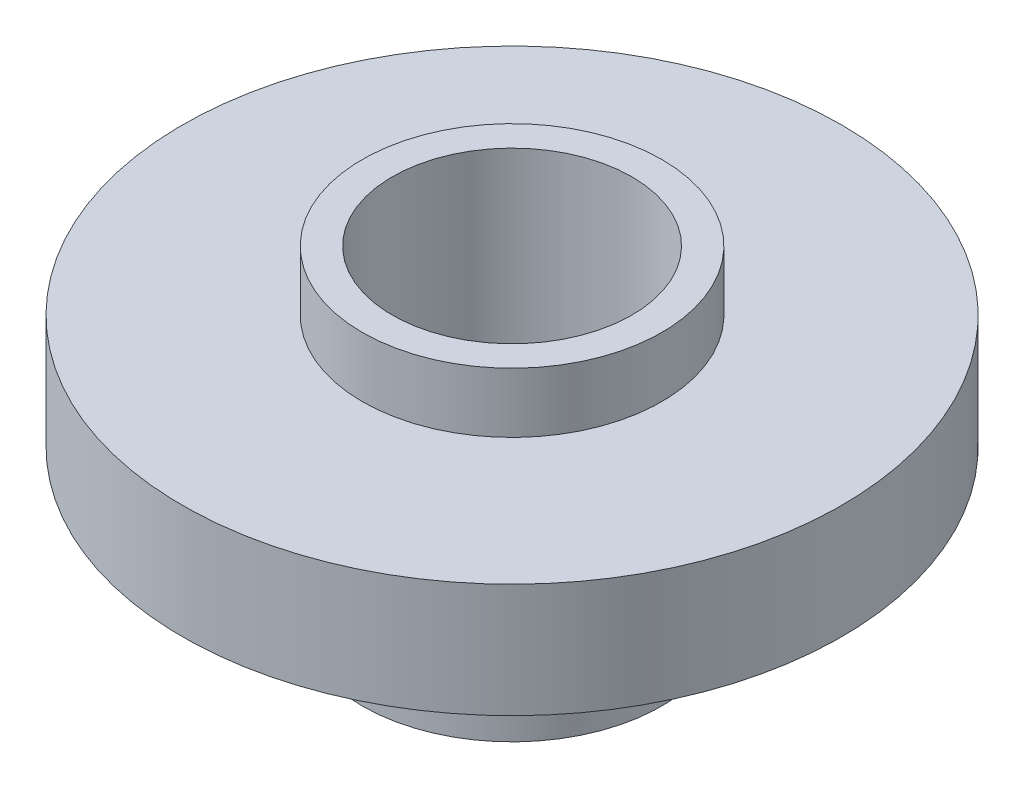
ISO-10303-21;
HEADER;
FILE_DESCRIPTION(('STEP AP214'),'2;1');
FILE_NAME('part.step','',(''),(''),'','','');
FILE_SCHEMA(('AUTOMOTIVE_DESIGN { 1 0 10303 214 1 1 1 1 }'));
ENDSEC;
DATA;
#1=APPLICATION_CONTEXT('core data for automotive mechanical design processes');
#2=APPLICATION_PROTOCOL_DEFINITION('international standard','automotive_design',2000,#1);
#3=PRODUCT_CONTEXT('',#1,'mechanical');
#4=PRODUCT('Part','Part','',(#3));
#5=PRODUCT_RELATED_PRODUCT_CATEGORY('part','',(#4));
#6=PRODUCT_DEFINITION_FORMATION('','',#4);
#7=PRODUCT_DEFINITION_CONTEXT('part definition',#1,'design');
#8=PRODUCT_DEFINITION('design','',#6,#7);
#9=PRODUCT_DEFINITION_SHAPE('','',#8);
#10=(LENGTH_UNIT() NAMED_UNIT(*) SI_UNIT(.MILLI.,.METRE.));
#11=(NAMED_UNIT(*) PLANE_ANGLE_UNIT() SI_UNIT($,.RADIAN.));
#12=(NAMED_UNIT(*) SI_UNIT($,.STERADIAN.) SOLID_ANGLE_UNIT());
#13=UNCERTAINTY_MEASURE_WITH_UNIT(LENGTH_MEASURE(1.E-05),#10,'distance_accuracy_value','');
#14=(GEOMETRIC_REPRESENTATION_CONTEXT(3) GLOBAL_UNCERTAINTY_ASSIGNED_CONTEXT((#13)) GLOBAL_UNIT_ASSIGNED_CONTEXT((#10,
#11,#12)) REPRESENTATION_CONTEXT('',''));
#15=CARTESIAN_POINT('',(0.,0.,0.));
#16=DIRECTION('',(0.,0.,1.));
#17=DIRECTION('',(1.,0.,0.));
#18=AXIS2_PLACEMENT_3D('',#15,#16,#17);
#19=CARTESIAN_POINT('',(-3.73244816247052,3.8,0.493369584694379));
#20=DIRECTION('',(0.,1.,0.));
#21=DIRECTION('',(0.,0.,1.));
#22=AXIS2_PLACEMENT_3D('',#19,#20,#21);
#23=PLANE('',#22);
#24=CARTESIAN_POINT('',(-3.73244816247052,3.8,0.493369584694379));
#25=DIRECTION('',(0.,1.,0.));
#26=DIRECTION('',(0.,0.,1.));
#27=AXIS2_PLACEMENT_3D('',#24,#25,#26);
#28=CIRCLE('',#27,5.);
#29=CARTESIAN_POINT('',(-3.73244816247052,3.8,-4.50663041530562));
#30=VERTEX_POINT('',#29);
#31=EDGE_CURVE('E10',#30,#30,#28,.T.);
#32=ORIENTED_EDGE('',*,*,#31,.F.);
#33=EDGE_LOOP('',(#32));
#34=FACE_BOUND('',#33,.T.);
#35=CARTESIAN_POINT('',(-3.73244816247052,3.8,0.493369584694379));
#36=DIRECTION('',(0.,1.,0.));
#37=DIRECTION('',(0.,0.,1.));
#38=AXIS2_PLACEMENT_3D('',#35,#36,#37);
#39=CIRCLE('',#38,11.);
#40=CARTESIAN_POINT('',(-3.73244816247052,3.8,-10.5066304153056));
#41=VERTEX_POINT('',#40);
#42=EDGE_CURVE('E40',#41,#41,#39,.T.);
#43=ORIENTED_EDGE('',*,*,#42,.T.);
#44=EDGE_LOOP('',(#43));
#45=FACE_BOUND('',#44,.T.);
#46=ADVANCED_FACE('F32',(#34,#45),#23,.T.);
#47=CARTESIAN_POINT('',(-3.73244816247052,0.,0.493369584694379));
#48=DIRECTION('',(0.,1.,0.));
#49=DIRECTION('',(0.,0.,1.));
#50=AXIS2_PLACEMENT_3D('',#47,#48,#49);
#51=PLANE('',#50);
#52=CARTESIAN_POINT('',(-3.73244816247052,0.,0.493369584694379));
#53=DIRECTION('',(0.,1.,0.));
#54=DIRECTION('',(0.,0.,1.));
#55=AXIS2_PLACEMENT_3D('',#52,#53,#54);
#56=CIRCLE('',#55,5.);
#57=CARTESIAN_POINT('',(-3.73244816247052,0.,-4.50663041530562));
#58=VERTEX_POINT('',#57);
#59=EDGE_CURVE('E36',#58,#58,#56,.T.);
#60=ORIENTED_EDGE('',*,*,#59,.T.);
#61=EDGE_LOOP('',(#60));
#62=FACE_BOUND('',#61,.T.);
#63=CARTESIAN_POINT('',(-3.73244816247052,0.,0.493369584694379));
#64=DIRECTION('',(0.,1.,0.));
#65=DIRECTION('',(0.,0.,1.));
#66=AXIS2_PLACEMENT_3D('',#63,#64,#65);
#67=CIRCLE('',#66,11.);
#68=CARTESIAN_POINT('',(-3.73244816247052,0.,-10.5066304153056));
#69=VERTEX_POINT('',#68);
#70=EDGE_CURVE('E45',#69,#69,#67,.T.);
#71=ORIENTED_EDGE('',*,*,#70,.F.);
#72=EDGE_LOOP('',(#71));
#73=FACE_BOUND('',#72,.T.);
#74=ADVANCED_FACE('F88',(#62,#73),#51,.F.);
#75=CARTESIAN_POINT('',(-3.73244816247052,3.8,0.493369584694379));
#76=DIRECTION('',(0.,-1.,0.));
#77=DIRECTION('',(0.,0.,-1.));
#78=AXIS2_PLACEMENT_3D('',#75,#76,#77);
#79=CYLINDRICAL_SURFACE('',#78,11.);
#80=CARTESIAN_POINT('',(-3.73244816247052,3.8,-10.5066304153056));
#81=CARTESIAN_POINT('',(-3.73244816247052,3.76041666666667,-10.5066304153056));
#82=CARTESIAN_POINT('',(-3.73244816247052,3.72083333333333,-10.5066304153056));
#83=CARTESIAN_POINT('',(-3.73244816247052,3.64166666666667,-10.5066304153056));
#84=CARTESIAN_POINT('',(-3.73244816247052,3.60208333333333,-10.5066304153056));
#85=CARTESIAN_POINT('',(-3.73244816247052,3.52291666666667,-10.5066304153056));
#86=CARTESIAN_POINT('',(-3.73244816247052,3.48333333333333,-10.5066304153056));
#87=CARTESIAN_POINT('',(-3.73244816247052,3.40416666666667,-10.5066304153056));
#88=CARTESIAN_POINT('',(-3.73244816247052,3.36458333333333,-10.5066304153056));
#89=CARTESIAN_POINT('',(-3.73244816247052,3.28541666666667,-10.5066304153056));
#90=CARTESIAN_POINT('',(-3.73244816247052,3.24583333333333,-10.5066304153056));
#91=CARTESIAN_POINT('',(-3.73244816247052,3.16666666666667,-10.5066304153056));
#92=CARTESIAN_POINT('',(-3.73244816247052,3.12708333333333,-10.5066304153056));
#93=CARTESIAN_POINT('',(-3.73244816247052,3.04791666666667,-10.5066304153056));
#94=CARTESIAN_POINT('',(-3.73244816247052,3.00833333333333,-10.5066304153056));
#95=CARTESIAN_POINT('',(-3.73244816247052,2.92916666666667,-10.5066304153056));
#96=CARTESIAN_POINT('',(-3.73244816247052,2.88958333333333,-10.5066304153056));
#97=CARTESIAN_POINT('',(-3.73244816247052,2.81041666666667,-10.5066304153056));
#98=CARTESIAN_POINT('',(-3.73244816247052,2.77083333333333,-10.5066304153056));
#99=CARTESIAN_POINT('',(-3.73244816247052,2.69166666666667,-10.5066304153056));
#100=CARTESIAN_POINT('',(-3.73244816247052,2.65208333333333,-10.5066304153056));
#101=CARTESIAN_POINT('',(-3.73244816247052,2.57291666666667,-10.5066304153056));
#102=CARTESIAN_POINT('',(-3.73244816247052,2.53333333333333,-10.5066304153056));
#103=CARTESIAN_POINT('',(-3.73244816247052,2.45416666666667,-10.5066304153056));
#104=CARTESIAN_POINT('',(-3.73244816247052,2.41458333333333,-10.5066304153056));
#105=CARTESIAN_POINT('',(-3.73244816247052,2.33541666666667,-10.5066304153056));
#106=CARTESIAN_POINT('',(-3.73244816247052,2.29583333333333,-10.5066304153056));
#107=CARTESIAN_POINT('',(-3.73244816247052,2.21666666666667,-10.5066304153056));
#108=CARTESIAN_POINT('',(-3.73244816247052,2.17708333333333,-10.5066304153056));
#109=CARTESIAN_POINT('',(-3.73244816247052,2.09791666666667,-10.5066304153056));
#110=CARTESIAN_POINT('',(-3.73244816247052,2.05833333333333,-10.5066304153056));
#111=CARTESIAN_POINT('',(-3.73244816247052,1.97916666666667,-10.5066304153056));
#112=CARTESIAN_POINT('',(-3.73244816247052,1.93958333333333,-10.5066304153056));
#113=CARTESIAN_POINT('',(-3.73244816247052,1.86041666666667,-10.5066304153056));
#114=CARTESIAN_POINT('',(-3.73244816247052,1.82083333333333,-10.5066304153056));
#115=CARTESIAN_POINT('',(-3.73244816247052,1.74166666666667,-10.5066304153056));
#116=CARTESIAN_POINT('',(-3.73244816247052,1.70208333333333,-10.5066304153056));
#117=CARTESIAN_POINT('',(-3.73244816247052,1.62291666666667,-10.5066304153056));
#118=CARTESIAN_POINT('',(-3.73244816247052,1.58333333333333,-10.5066304153056));
#119=CARTESIAN_POINT('',(-3.73244816247052,1.50416666666667,-10.5066304153056));
#120=CARTESIAN_POINT('',(-3.73244816247052,1.46458333333333,-10.5066304153056));
#121=CARTESIAN_POINT('',(-3.73244816247052,1.38541666666667,-10.5066304153056));
#122=CARTESIAN_POINT('',(-3.73244816247052,1.34583333333333,-10.5066304153056));
#123=CARTESIAN_POINT('',(-3.73244816247052,1.26666666666667,-10.5066304153056));
#124=CARTESIAN_POINT('',(-3.73244816247052,1.22708333333333,-10.5066304153056));
#125=CARTESIAN_POINT('',(-3.73244816247052,1.14791666666667,-10.5066304153056));
#126=CARTESIAN_POINT('',(-3.73244816247052,1.10833333333333,-10.5066304153056));
#127=CARTESIAN_POINT('',(-3.73244816247052,1.02916666666667,-10.5066304153056));
#128=CARTESIAN_POINT('',(-3.73244816247052,0.989583333333333,-10.5066304153056));
#129=CARTESIAN_POINT('',(-3.73244816247052,0.910416666666667,-10.5066304153056));
#130=CARTESIAN_POINT('',(-3.73244816247052,0.870833333333333,-10.5066304153056));
#131=CARTESIAN_POINT('',(-3.73244816247052,0.791666666666667,-10.5066304153056));
#132=CARTESIAN_POINT('',(-3.73244816247052,0.752083333333333,-10.5066304153056));
#133=CARTESIAN_POINT('',(-3.73244816247052,0.672916666666667,-10.5066304153056));
#134=CARTESIAN_POINT('',(-3.73244816247052,0.633333333333333,-10.5066304153056));
#135=CARTESIAN_POINT('',(-3.73244816247052,0.554166666666667,-10.5066304153056));
#136=CARTESIAN_POINT('',(-3.73244816247052,0.514583333333334,-10.5066304153056));
#137=CARTESIAN_POINT('',(-3.73244816247052,0.435416666666667,-10.5066304153056));
#138=CARTESIAN_POINT('',(-3.73244816247052,0.395833333333333,-10.5066304153056));
#139=CARTESIAN_POINT('',(-3.73244816247052,0.316666666666666,-10.5066304153056));
#140=CARTESIAN_POINT('',(-3.73244816247052,0.277083333333333,-10.5066304153056));
#141=CARTESIAN_POINT('',(-3.73244816247052,0.197916666666667,-10.5066304153056));
#142=CARTESIAN_POINT('',(-3.73244816247052,0.158333333333333,-10.5066304153056));
#143=CARTESIAN_POINT('',(-3.73244816247052,0.0791666666666666,-10.5066304153056));
#144=CARTESIAN_POINT('',(-3.73244816247052,0.0395833333333333,-10.5066304153056));
#145=CARTESIAN_POINT('',(-3.73244816247052,0.,-10.5066304153056));
#146=B_SPLINE_CURVE_WITH_KNOTS('',3,(#80,#81,#82,#83,#84,#85,#86,#87,#88,#89,#90,#91,#92,#93,
#94,#95,#96,#97,#98,#99,#100,#101,#102,#103,#104,#105,#106,#107,#108,#109,#110,#111,#112,#113,
#114,#115,#116,#117,#118,#119,#120,#121,#122,#123,#124,#125,#126,#127,#128,#129,#130,#131,#132,
#133,#134,#135,#136,#137,#138,#139,#140,#141,#142,#143,#144,#145),.UNSPECIFIED.,.F.,.F.,(4,2,2,
2,2,2,2,2,2,2,2,2,2,2,2,2,2,2,2,2,2,2,2,2,2,2,2,2,2,2,2,2,4),(0.,0.11875,0.2375,0.35625,0.475,
0.59375,0.7125,0.831249999999999,0.95,1.06875,1.1875,1.30625,1.425,1.54375,1.6625,1.78125,1.9,
2.01875,2.1375,2.25625,2.375,2.49375,2.6125,2.73125,2.85,2.96875,3.0875,3.20625,3.325,3.44375,
3.5625,3.68125,3.8),.UNSPECIFIED.);
#147=EDGE_CURVE('BSEAM34',#41,#69,#146,.T.);
#148=ORIENTED_EDGE('',*,*,#42,.F.);
#149=ORIENTED_EDGE('',*,*,#70,.T.);
#150=ORIENTED_EDGE('',*,*,#147,.T.);
#151=ORIENTED_EDGE('',*,*,#147,.F.);
#152=EDGE_LOOP('',(#148,#150,#149,#151));
#153=FACE_BOUND('',#152,.T.);
#154=ADVANCED_FACE('F34',(#153),#79,.T.);
#155=CARTESIAN_POINT('',(-3.73244816247052,5.800000094,0.493369584694379));
#156=DIRECTION('',(0.,-1.,0.));
#157=DIRECTION('',(0.,0.,-1.));
#158=AXIS2_PLACEMENT_3D('',#155,#156,#157);
#159=CYLINDRICAL_SURFACE('',#158,5.);
#160=CARTESIAN_POINT('',(-3.73244816247052,-4.999999906,0.493369584694379));
#161=DIRECTION('',(0.,-1.,0.));
#162=DIRECTION('',(0.,0.,-1.));
#163=AXIS2_PLACEMENT_3D('',#160,#161,#162);
#164=CIRCLE('',#163,5.);
#165=CARTESIAN_POINT('',(-3.73244816247052,-4.999999906,-4.50663041530562));
#166=VERTEX_POINT('',#165);
#167=EDGE_CURVE('E48',#166,#166,#164,.T.);
#168=CARTESIAN_POINT('',(-3.73244816247052,-4.999999906,-4.50663041530562));
#169=CARTESIAN_POINT('',(-3.73244816247052,-4.94791657364583,-4.50663041530562));
#170=CARTESIAN_POINT('',(-3.73244816247052,-4.89583324129167,-4.50663041530562));
#171=CARTESIAN_POINT('',(-3.73244816247052,-4.79166657658333,-4.50663041530562));
#172=CARTESIAN_POINT('',(-3.73244816247052,-4.73958324422917,-4.50663041530562));
#173=CARTESIAN_POINT('',(-3.73244816247052,-4.63541657952083,-4.50663041530562));
#174=CARTESIAN_POINT('',(-3.73244816247052,-4.58333324716666,-4.50663041530562));
#175=CARTESIAN_POINT('',(-3.73244816247052,-4.47916658245833,-4.50663041530562));
#176=CARTESIAN_POINT('',(-3.73244816247052,-4.42708325010416,-4.50663041530562));
#177=CARTESIAN_POINT('',(-3.73244816247052,-4.32291658539583,-4.50663041530562));
#178=CARTESIAN_POINT('',(-3.73244816247052,-4.27083325304166,-4.50663041530562));
#179=CARTESIAN_POINT('',(-3.73244816247052,-4.16666658833333,-4.50663041530562));
#180=CARTESIAN_POINT('',(-3.73244816247052,-4.11458325597916,-4.50663041530562));
#181=CARTESIAN_POINT('',(-3.73244816247052,-4.01041659127083,-4.50663041530562));
#182=CARTESIAN_POINT('',(-3.73244816247052,-3.95833325891666,-4.50663041530562));
#183=CARTESIAN_POINT('',(-3.73244816247052,-3.85416659420833,-4.50663041530562));
#184=CARTESIAN_POINT('',(-3.73244816247052,-3.80208326185416,-4.50663041530562));
#185=CARTESIAN_POINT('',(-3.73244816247052,-3.69791659714583,-4.50663041530562));
#186=CARTESIAN_POINT('',(-3.73244816247052,-3.64583326479166,-4.50663041530562));
#187=CARTESIAN_POINT('',(-3.73244816247052,-3.54166660008333,-4.50663041530562));
#188=CARTESIAN_POINT('',(-3.73244816247052,-3.48958326772917,-4.50663041530562));
#189=CARTESIAN_POINT('',(-3.73244816247052,-3.38541660302083,-4.50663041530562));
#190=CARTESIAN_POINT('',(-3.73244816247052,-3.33333327066666,-4.50663041530562));
#191=CARTESIAN_POINT('',(-3.73244816247052,-3.22916660595833,-4.50663041530562));
#192=CARTESIAN_POINT('',(-3.73244816247052,-3.17708327360417,-4.50663041530562));
#193=CARTESIAN_POINT('',(-3.73244816247052,-3.07291660889583,-4.50663041530562));
#194=CARTESIAN_POINT('',(-3.73244816247052,-3.02083327654166,-4.50663041530562));
#195=CARTESIAN_POINT('',(-3.73244816247052,-2.91666661183333,-4.50663041530562));
#196=CARTESIAN_POINT('',(-3.73244816247052,-2.86458327947917,-4.50663041530562));
#197=CARTESIAN_POINT('',(-3.73244816247052,-2.76041661477083,-4.50663041530562));
#198=CARTESIAN_POINT('',(-3.73244816247052,-2.70833328241667,-4.50663041530562));
#199=CARTESIAN_POINT('',(-3.73244816247052,-2.60416661770833,-4.50663041530562));
#200=CARTESIAN_POINT('',(-3.73244816247052,-2.55208328535417,-4.50663041530562));
#201=CARTESIAN_POINT('',(-3.73244816247052,-2.44791662064583,-4.50663041530562));
#202=CARTESIAN_POINT('',(-3.73244816247052,-2.39583328829166,-4.50663041530562));
#203=CARTESIAN_POINT('',(-3.73244816247052,-2.29166662358333,-4.50663041530562));
#204=CARTESIAN_POINT('',(-3.73244816247052,-2.23958329122916,-4.50663041530562));
#205=CARTESIAN_POINT('',(-3.73244816247052,-2.13541662652083,-4.50663041530562));
#206=CARTESIAN_POINT('',(-3.73244816247052,-2.08333329416667,-4.50663041530562));
#207=CARTESIAN_POINT('',(-3.73244816247052,-1.97916662945833,-4.50663041530562));
#208=CARTESIAN_POINT('',(-3.73244816247052,-1.92708329710417,-4.50663041530562));
#209=CARTESIAN_POINT('',(-3.73244816247052,-1.82291663239583,-4.50663041530562));
#210=CARTESIAN_POINT('',(-3.73244816247052,-1.77083330004167,-4.50663041530562));
#211=CARTESIAN_POINT('',(-3.73244816247052,-1.66666663533333,-4.50663041530562));
#212=CARTESIAN_POINT('',(-3.73244816247052,-1.61458330297917,-4.50663041530562));
#213=CARTESIAN_POINT('',(-3.73244816247052,-1.51041663827083,-4.50663041530562));
#214=CARTESIAN_POINT('',(-3.73244816247052,-1.45833330591667,-4.50663041530562));
#215=CARTESIAN_POINT('',(-3.73244816247052,-1.35416664120833,-4.50663041530562));
#216=CARTESIAN_POINT('',(-3.73244816247052,-1.30208330885417,-4.50663041530562));
#217=CARTESIAN_POINT('',(-3.73244816247052,-1.19791664414583,-4.50663041530562));
#218=CARTESIAN_POINT('',(-3.73244816247052,-1.14583331179167,-4.50663041530562));
#219=CARTESIAN_POINT('',(-3.73244816247052,-1.04166664708333,-4.50663041530562));
#220=CARTESIAN_POINT('',(-3.73244816247052,-0.989583314729166,-4.50663041530562));
#221=CARTESIAN_POINT('',(-3.73244816247052,-0.885416650020833,-4.50663041530562));
#222=CARTESIAN_POINT('',(-3.73244816247052,-0.833333317666666,-4.50663041530562));
#223=CARTESIAN_POINT('',(-3.73244816247052,-0.729166652958333,-4.50663041530562));
#224=CARTESIAN_POINT('',(-3.73244816247052,-0.677083320604167,-4.50663041530562));
#225=CARTESIAN_POINT('',(-3.73244816247052,-0.572916655895834,-4.50663041530562));
#226=CARTESIAN_POINT('',(-3.73244816247052,-0.520833323541667,-4.50663041530562));
#227=CARTESIAN_POINT('',(-3.73244816247052,-0.416666658833334,-4.50663041530562));
#228=CARTESIAN_POINT('',(-3.73244816247052,-0.364583326479167,-4.50663041530562));
#229=CARTESIAN_POINT('',(-3.73244816247052,-0.260416661770833,-4.50663041530562));
#230=CARTESIAN_POINT('',(-3.73244816247052,-0.208333329416667,-4.50663041530562));
#231=CARTESIAN_POINT('',(-3.73244816247052,-0.104166664708333,-4.50663041530562));
#232=CARTESIAN_POINT('',(-3.73244816247052,-0.0520833323541666,-4.50663041530562));
#233=CARTESIAN_POINT('',(-3.73244816247052,0.,-4.50663041530562));
#234=B_SPLINE_CURVE_WITH_KNOTS('',3,(#168,#169,#170,#171,#172,#173,#174,#175,#176,#177,#178,
#179,#180,#181,#182,#183,#184,#185,#186,#187,#188,#189,#190,#191,#192,#193,#194,#195,#196,#197,
#198,#199,#200,#201,#202,#203,#204,#205,#206,#207,#208,#209,#210,#211,#212,#213,#214,#215,#216,
#217,#218,#219,#220,#221,#222,#223,#224,#225,#226,#227,#228,#229,#230,#231,#232,#233),
.UNSPECIFIED.,.F.,.F.,(4,2,2,2,2,2,2,2,2,2,2,2,2,2,2,2,2,2,2,2,2,2,2,2,2,2,2,2,2,2,2,2,4),(0.,
0.156249997062499,0.312499994125,0.468749991187499,0.62499998825,0.781249985312499,
0.937499982375,1.0937499794375,1.2499999765,1.4062499735625,1.562499970625,1.7187499676875,
1.87499996475,2.0312499618125,2.187499958875,2.3437499559375,2.499999953,2.6562499500625,
2.812499947125,2.9687499441875,3.12499994125,3.2812499383125,3.437499935375,3.5937499324375,
3.7499999295,3.9062499265625,4.062499923625,4.2187499206875,4.37499991775,4.5312499148125,
4.687499911875,4.8437499089375,4.999999906),.UNSPECIFIED.);
#235=EDGE_CURVE('BSEAM83',#166,#58,#234,.T.);
#236=ORIENTED_EDGE('',*,*,#167,.F.);
#237=ORIENTED_EDGE('',*,*,#59,.F.);
#238=ORIENTED_EDGE('',*,*,#235,.T.);
#239=ORIENTED_EDGE('',*,*,#235,.F.);
#240=EDGE_LOOP('',(#236,#238,#237,#239));
#241=FACE_BOUND('',#240,.T.);
#242=ADVANCED_FACE('F83',(#241),#159,.T.);
#243=CARTESIAN_POINT('',(-3.73244816247052,-4.999999906,0.493369584694379));
#244=DIRECTION('',(0.,-1.,0.));
#245=DIRECTION('',(0.,0.,-1.));
#246=AXIS2_PLACEMENT_3D('',#243,#244,#245);
#247=PLANE('',#246);
#248=CARTESIAN_POINT('',(-3.73244816247052,-4.999999906,0.493369584694379));
#249=DIRECTION('',(0.,-1.,0.));
#250=DIRECTION('',(0.,0.,-1.));
#251=AXIS2_PLACEMENT_3D('',#248,#249,#250);
#252=CIRCLE('',#251,4.);
#253=CARTESIAN_POINT('',(-3.73244816247052,-4.999999906,-3.50663041530562));
#254=VERTEX_POINT('',#253);
#255=EDGE_CURVE('E63',#254,#254,#252,.T.);
#256=ORIENTED_EDGE('',*,*,#255,.F.);
#257=EDGE_LOOP('',(#256));
#258=FACE_BOUND('',#257,.T.);
#259=ORIENTED_EDGE('',*,*,#167,.T.);
#260=EDGE_LOOP('',(#259));
#261=FACE_BOUND('',#260,.T.);
#262=ADVANCED_FACE('F75',(#258,#261),#247,.T.);
#263=CARTESIAN_POINT('',(-3.73244816247052,3.8,0.493369584694379));
#264=DIRECTION('',(0.,-1.,0.));
#265=DIRECTION('',(0.,0.,-1.));
#266=AXIS2_PLACEMENT_3D('',#263,#264,#265);
#267=CYLINDRICAL_SURFACE('',#266,4.);
#268=CARTESIAN_POINT('',(-3.73244816247052,5.800000094,0.493369584694379));
#269=DIRECTION('',(0.,-1.,0.));
#270=DIRECTION('',(0.,0.,-1.));
#271=AXIS2_PLACEMENT_3D('',#268,#269,#270);
#272=CIRCLE('',#271,4.);
#273=CARTESIAN_POINT('',(-3.73244816247052,5.800000094,-3.50663041530562));
#274=VERTEX_POINT('',#273);
#275=EDGE_CURVE('E61',#274,#274,#272,.T.);
#276=CARTESIAN_POINT('',(-3.73244816247052,-4.999999906,-3.50663041530562));
#277=CARTESIAN_POINT('',(-3.73244816247052,-4.887499906,-3.50663041530562));
#278=CARTESIAN_POINT('',(-3.73244816247052,-4.774999906,-3.50663041530562));
#279=CARTESIAN_POINT('',(-3.73244816247052,-4.549999906,-3.50663041530562));
#280=CARTESIAN_POINT('',(-3.73244816247052,-4.437499906,-3.50663041530562));
#281=CARTESIAN_POINT('',(-3.73244816247052,-4.212499906,-3.50663041530562));
#282=CARTESIAN_POINT('',(-3.73244816247052,-4.099999906,-3.50663041530562));
#283=CARTESIAN_POINT('',(-3.73244816247052,-3.874999906,-3.50663041530562));
#284=CARTESIAN_POINT('',(-3.73244816247052,-3.762499906,-3.50663041530562));
#285=CARTESIAN_POINT('',(-3.73244816247052,-3.537499906,-3.50663041530562));
#286=CARTESIAN_POINT('',(-3.73244816247052,-3.424999906,-3.50663041530562));
#287=CARTESIAN_POINT('',(-3.73244816247052,-3.199999906,-3.50663041530562));
#288=CARTESIAN_POINT('',(-3.73244816247052,-3.087499906,-3.50663041530562));
#289=CARTESIAN_POINT('',(-3.73244816247052,-2.862499906,-3.50663041530562));
#290=CARTESIAN_POINT('',(-3.73244816247052,-2.749999906,-3.50663041530562));
#291=CARTESIAN_POINT('',(-3.73244816247052,-2.524999906,-3.50663041530562));
#292=CARTESIAN_POINT('',(-3.73244816247052,-2.412499906,-3.50663041530562));
#293=CARTESIAN_POINT('',(-3.73244816247052,-2.187499906,-3.50663041530562));
#294=CARTESIAN_POINT('',(-3.73244816247052,-2.074999906,-3.50663041530562));
#295=CARTESIAN_POINT('',(-3.73244816247052,-1.849999906,-3.50663041530562));
#296=CARTESIAN_POINT('',(-3.73244816247052,-1.737499906,-3.50663041530562));
#297=CARTESIAN_POINT('',(-3.73244816247052,-1.512499906,-3.50663041530562));
#298=CARTESIAN_POINT('',(-3.73244816247052,-1.399999906,-3.50663041530562));
#299=CARTESIAN_POINT('',(-3.73244816247052,-1.174999906,-3.50663041530562));
#300=CARTESIAN_POINT('',(-3.73244816247052,-1.062499906,-3.50663041530562));
#301=CARTESIAN_POINT('',(-3.73244816247052,-0.837499905999999,-3.50663041530562));
#302=CARTESIAN_POINT('',(-3.73244816247052,-0.724999905999999,-3.50663041530562));
#303=CARTESIAN_POINT('',(-3.73244816247052,-0.499999905999999,-3.50663041530562));
#304=CARTESIAN_POINT('',(-3.73244816247052,-0.387499905999999,-3.50663041530562));
#305=CARTESIAN_POINT('',(-3.73244816247052,-0.162499905999999,-3.50663041530562));
#306=CARTESIAN_POINT('',(-3.73244816247052,-0.0499999059999994,-3.50663041530562));
#307=CARTESIAN_POINT('',(-3.73244816247052,0.175000094000001,-3.50663041530562));
#308=CARTESIAN_POINT('',(-3.73244816247052,0.287500094000001,-3.50663041530562));
#309=CARTESIAN_POINT('',(-3.73244816247052,0.512500094000001,-3.50663041530562));
#310=CARTESIAN_POINT('',(-3.73244816247052,0.625000094000001,-3.50663041530562));
#311=CARTESIAN_POINT('',(-3.73244816247052,0.850000094000001,-3.50663041530562));
#312=CARTESIAN_POINT('',(-3.73244816247052,0.962500094000001,-3.50663041530562));
#313=CARTESIAN_POINT('',(-3.73244816247052,1.187500094,-3.50663041530562));
#314=CARTESIAN_POINT('',(-3.73244816247052,1.300000094,-3.50663041530562));
#315=CARTESIAN_POINT('',(-3.73244816247052,1.525000094,-3.50663041530562));
#316=CARTESIAN_POINT('',(-3.73244816247052,1.637500094,-3.50663041530562));
#317=CARTESIAN_POINT('',(-3.73244816247052,1.862500094,-3.50663041530562));
#318=CARTESIAN_POINT('',(-3.73244816247052,1.975000094,-3.50663041530562));
#319=CARTESIAN_POINT('',(-3.73244816247052,2.200000094,-3.50663041530562));
#320=CARTESIAN_POINT('',(-3.73244816247052,2.312500094,-3.50663041530562));
#321=CARTESIAN_POINT('',(-3.73244816247052,2.537500094,-3.50663041530562));
#322=CARTESIAN_POINT('',(-3.73244816247052,2.650000094,-3.50663041530562));
#323=CARTESIAN_POINT('',(-3.73244816247052,2.875000094,-3.50663041530562));
#324=CARTESIAN_POINT('',(-3.73244816247052,2.987500094,-3.50663041530562));
#325=CARTESIAN_POINT('',(-3.73244816247052,3.212500094,-3.50663041530562));
#326=CARTESIAN_POINT('',(-3.73244816247052,3.325000094,-3.50663041530562));
#327=CARTESIAN_POINT('',(-3.73244816247052,3.550000094,-3.50663041530562));
#328=CARTESIAN_POINT('',(-3.73244816247052,3.662500094,-3.50663041530562));
#329=CARTESIAN_POINT('',(-3.73244816247052,3.887500094,-3.50663041530562));
#330=CARTESIAN_POINT('',(-3.73244816247052,4.000000094,-3.50663041530562));
#331=CARTESIAN_POINT('',(-3.73244816247052,4.225000094,-3.50663041530562));
#332=CARTESIAN_POINT('',(-3.73244816247052,4.337500094,-3.50663041530562));
#333=CARTESIAN_POINT('',(-3.73244816247052,4.562500094,-3.50663041530562));
#334=CARTESIAN_POINT('',(-3.73244816247052,4.675000094,-3.50663041530562));
#335=CARTESIAN_POINT('',(-3.73244816247052,4.900000094,-3.50663041530562));
#336=CARTESIAN_POINT('',(-3.73244816247052,5.012500094,-3.50663041530562));
#337=CARTESIAN_POINT('',(-3.73244816247052,5.237500094,-3.50663041530562));
#338=CARTESIAN_POINT('',(-3.73244816247052,5.350000094,-3.50663041530562));
#339=CARTESIAN_POINT('',(-3.73244816247052,5.575000094,-3.50663041530562));
#340=CARTESIAN_POINT('',(-3.73244816247052,5.687500094,-3.50663041530562));
#341=CARTESIAN_POINT('',(-3.73244816247052,5.800000094,-3.50663041530562));
#342=B_SPLINE_CURVE_WITH_KNOTS('',3,(#276,#277,#278,#279,#280,#281,#282,#283,#284,#285,#286,
#287,#288,#289,#290,#291,#292,#293,#294,#295,#296,#297,#298,#299,#300,#301,#302,#303,#304,#305,
#306,#307,#308,#309,#310,#311,#312,#313,#314,#315,#316,#317,#318,#319,#320,#321,#322,#323,#324,
#325,#326,#327,#328,#329,#330,#331,#332,#333,#334,#335,#336,#337,#338,#339,#340,#341),
.UNSPECIFIED.,.F.,.F.,(4,2,2,2,2,2,2,2,2,2,2,2,2,2,2,2,2,2,2,2,2,2,2,2,2,2,2,2,2,2,2,2,4),(0.,
0.337499999999999,0.675,1.0125,1.35,1.6875,2.025,2.3625,2.7,3.0375,3.375,3.7125,4.05,4.3875,
4.725,5.0625,5.4,5.7375,6.075,6.4125,6.75,7.0875,7.425,7.7625,8.1,8.4375,8.775,9.1125,9.45,
9.7875,10.125,10.4625,10.8),.UNSPECIFIED.);
#343=EDGE_CURVE('BSEAM72',#254,#274,#342,.T.);
#344=ORIENTED_EDGE('',*,*,#255,.T.);
#345=ORIENTED_EDGE('',*,*,#275,.F.);
#346=ORIENTED_EDGE('',*,*,#343,.T.);
#347=ORIENTED_EDGE('',*,*,#343,.F.);
#348=EDGE_LOOP('',(#344,#346,#345,#347));
#349=FACE_BOUND('',#348,.T.);
#350=ADVANCED_FACE('F72',(#349),#267,.F.);
#351=CARTESIAN_POINT('',(-3.73244816247052,5.800000094,0.493369584694379));
#352=DIRECTION('',(0.,-1.,0.));
#353=DIRECTION('',(0.,0.,-1.));
#354=AXIS2_PLACEMENT_3D('',#351,#352,#353);
#355=CIRCLE('',#354,5.);
#356=CARTESIAN_POINT('',(-3.73244816247052,5.800000094,-4.50663041530562));
#357=VERTEX_POINT('',#356);
#358=EDGE_CURVE('E54',#357,#357,#355,.T.);
#359=CARTESIAN_POINT('',(-3.73244816247052,3.8,-4.50663041530562));
#360=CARTESIAN_POINT('',(-3.73244816247052,3.8208333343125,-4.50663041530562));
#361=CARTESIAN_POINT('',(-3.73244816247052,3.841666668625,-4.50663041530562));
#362=CARTESIAN_POINT('',(-3.73244816247052,3.88333333725,-4.50663041530562));
#363=CARTESIAN_POINT('',(-3.73244816247052,3.9041666715625,-4.50663041530562));
#364=CARTESIAN_POINT('',(-3.73244816247052,3.9458333401875,-4.50663041530562));
#365=CARTESIAN_POINT('',(-3.73244816247052,3.9666666745,-4.50663041530562));
#366=CARTESIAN_POINT('',(-3.73244816247052,4.008333343125,-4.50663041530562));
#367=CARTESIAN_POINT('',(-3.73244816247052,4.0291666774375,-4.50663041530562));
#368=CARTESIAN_POINT('',(-3.73244816247052,4.0708333460625,-4.50663041530562));
#369=CARTESIAN_POINT('',(-3.73244816247052,4.091666680375,-4.50663041530562));
#370=CARTESIAN_POINT('',(-3.73244816247052,4.133333349,-4.50663041530562));
#371=CARTESIAN_POINT('',(-3.73244816247052,4.1541666833125,-4.50663041530562));
#372=CARTESIAN_POINT('',(-3.73244816247052,4.1958333519375,-4.50663041530562));
#373=CARTESIAN_POINT('',(-3.73244816247052,4.21666668625,-4.50663041530562));
#374=CARTESIAN_POINT('',(-3.73244816247052,4.258333354875,-4.50663041530562));
#375=CARTESIAN_POINT('',(-3.73244816247052,4.2791666891875,-4.50663041530562));
#376=CARTESIAN_POINT('',(-3.73244816247052,4.3208333578125,-4.50663041530562));
#377=CARTESIAN_POINT('',(-3.73244816247052,4.341666692125,-4.50663041530562));
#378=CARTESIAN_POINT('',(-3.73244816247052,4.38333336075,-4.50663041530562));
#379=CARTESIAN_POINT('',(-3.73244816247052,4.4041666950625,-4.50663041530562));
#380=CARTESIAN_POINT('',(-3.73244816247052,4.4458333636875,-4.50663041530562));
#381=CARTESIAN_POINT('',(-3.73244816247052,4.466666698,-4.50663041530562));
#382=CARTESIAN_POINT('',(-3.73244816247052,4.508333366625,-4.50663041530562));
#383=CARTESIAN_POINT('',(-3.73244816247052,4.5291667009375,-4.50663041530562));
#384=CARTESIAN_POINT('',(-3.73244816247052,4.5708333695625,-4.50663041530562));
#385=CARTESIAN_POINT('',(-3.73244816247052,4.591666703875,-4.50663041530562));
#386=CARTESIAN_POINT('',(-3.73244816247052,4.6333333725,-4.50663041530562));
#387=CARTESIAN_POINT('',(-3.73244816247052,4.6541667068125,-4.50663041530562));
#388=CARTESIAN_POINT('',(-3.73244816247052,4.6958333754375,-4.50663041530562));
#389=CARTESIAN_POINT('',(-3.73244816247052,4.71666670975,-4.50663041530562));
#390=CARTESIAN_POINT('',(-3.73244816247052,4.758333378375,-4.50663041530562));
#391=CARTESIAN_POINT('',(-3.73244816247052,4.7791667126875,-4.50663041530562));
#392=CARTESIAN_POINT('',(-3.73244816247052,4.8208333813125,-4.50663041530562));
#393=CARTESIAN_POINT('',(-3.73244816247052,4.841666715625,-4.50663041530562));
#394=CARTESIAN_POINT('',(-3.73244816247052,4.88333338425,-4.50663041530562));
#395=CARTESIAN_POINT('',(-3.73244816247052,4.9041667185625,-4.50663041530562));
#396=CARTESIAN_POINT('',(-3.73244816247052,4.9458333871875,-4.50663041530562));
#397=CARTESIAN_POINT('',(-3.73244816247052,4.9666667215,-4.50663041530562));
#398=CARTESIAN_POINT('',(-3.73244816247052,5.008333390125,-4.50663041530562));
#399=CARTESIAN_POINT('',(-3.73244816247052,5.0291667244375,-4.50663041530562));
#400=CARTESIAN_POINT('',(-3.73244816247052,5.0708333930625,-4.50663041530562));
#401=CARTESIAN_POINT('',(-3.73244816247052,5.091666727375,-4.50663041530562));
#402=CARTESIAN_POINT('',(-3.73244816247052,5.133333396,-4.50663041530562));
#403=CARTESIAN_POINT('',(-3.73244816247052,5.1541667303125,-4.50663041530562));
#404=CARTESIAN_POINT('',(-3.73244816247052,5.1958333989375,-4.50663041530562));
#405=CARTESIAN_POINT('',(-3.73244816247052,5.21666673325,-4.50663041530562));
#406=CARTESIAN_POINT('',(-3.73244816247052,5.258333401875,-4.50663041530562));
#407=CARTESIAN_POINT('',(-3.73244816247052,5.2791667361875,-4.50663041530562));
#408=CARTESIAN_POINT('',(-3.73244816247052,5.3208334048125,-4.50663041530562));
#409=CARTESIAN_POINT('',(-3.73244816247052,5.341666739125,-4.50663041530562));
#410=CARTESIAN_POINT('',(-3.73244816247052,5.38333340775,-4.50663041530562));
#411=CARTESIAN_POINT('',(-3.73244816247052,5.4041667420625,-4.50663041530562));
#412=CARTESIAN_POINT('',(-3.73244816247052,5.4458334106875,-4.50663041530562));
#413=CARTESIAN_POINT('',(-3.73244816247052,5.466666745,-4.50663041530562));
#414=CARTESIAN_POINT('',(-3.73244816247052,5.508333413625,-4.50663041530562));
#415=CARTESIAN_POINT('',(-3.73244816247052,5.5291667479375,-4.50663041530562));
#416=CARTESIAN_POINT('',(-3.73244816247052,5.5708334165625,-4.50663041530562));
#417=CARTESIAN_POINT('',(-3.73244816247052,5.591666750875,-4.50663041530562));
#418=CARTESIAN_POINT('',(-3.73244816247052,5.6333334195,-4.50663041530562));
#419=CARTESIAN_POINT('',(-3.73244816247052,5.6541667538125,-4.50663041530562));
#420=CARTESIAN_POINT('',(-3.73244816247052,5.6958334224375,-4.50663041530562));
#421=CARTESIAN_POINT('',(-3.73244816247052,5.71666675675,-4.50663041530562));
#422=CARTESIAN_POINT('',(-3.73244816247052,5.758333425375,-4.50663041530562));
#423=CARTESIAN_POINT('',(-3.73244816247052,5.7791667596875,-4.50663041530562));
#424=CARTESIAN_POINT('',(-3.73244816247052,5.800000094,-4.50663041530562));
#425=B_SPLINE_CURVE_WITH_KNOTS('',3,(#359,#360,#361,#362,#363,#364,#365,#366,#367,#368,#369,
#370,#371,#372,#373,#374,#375,#376,#377,#378,#379,#380,#381,#382,#383,#384,#385,#386,#387,#388,
#389,#390,#391,#392,#393,#394,#395,#396,#397,#398,#399,#400,#401,#402,#403,#404,#405,#406,#407,
#408,#409,#410,#411,#412,#413,#414,#415,#416,#417,#418,#419,#420,#421,#422,#423,#424),
.UNSPECIFIED.,.F.,.F.,(4,2,2,2,2,2,2,2,2,2,2,2,2,2,2,2,2,2,2,2,2,2,2,2,2,2,2,2,2,2,2,2,4),(0.,
0.0625000029374997,0.125000005875,0.1875000088125,0.25000001175,0.3125000146875,0.375000017625,
0.4375000205625,0.500000023500001,0.5625000264375,0.625000029375001,0.6875000323125,
0.75000003525,0.8125000381875,0.875000041125,0.937500044062501,1.000000047,1.0625000499375,
1.125000052875,1.1875000558125,1.25000005875,1.3125000616875,1.375000064625,1.4375000675625,
1.5000000705,1.5625000734375,1.625000076375,1.6875000793125,1.75000008225,1.8125000851875,
1.875000088125,1.9375000910625,2.000000094),.UNSPECIFIED.);
#426=EDGE_CURVE('BSEAM74',#30,#357,#425,.T.);
#427=ORIENTED_EDGE('',*,*,#31,.T.);
#428=ORIENTED_EDGE('',*,*,#358,.T.);
#429=ORIENTED_EDGE('',*,*,#426,.T.);
#430=ORIENTED_EDGE('',*,*,#426,.F.);
#431=EDGE_LOOP('',(#427,#429,#428,#430));
#432=FACE_BOUND('',#431,.T.);
#433=ADVANCED_FACE('F74',(#432),#159,.T.);
#434=CARTESIAN_POINT('',(-3.73244816247052,5.800000094,0.493369584694379));
#435=DIRECTION('',(0.,-1.,0.));
#436=DIRECTION('',(0.,0.,-1.));
#437=AXIS2_PLACEMENT_3D('',#434,#435,#436);
#438=PLANE('',#437);
#439=ORIENTED_EDGE('',*,*,#275,.T.);
#440=EDGE_LOOP('',(#439));
#441=FACE_BOUND('',#440,.T.);
#442=ORIENTED_EDGE('',*,*,#358,.F.);
#443=EDGE_LOOP('',(#442));
#444=FACE_BOUND('',#443,.T.);
#445=ADVANCED_FACE('F69',(#441,#444),#438,.F.);
#446=CLOSED_SHELL('',(#46,#74,#154,#242,#262,#350,#433,#445));
#447=MANIFOLD_SOLID_BREP('B2',#446);
#448=ADVANCED_BREP_SHAPE_REPRESENTATION('',(#18,#447),#14);
#449=SHAPE_DEFINITION_REPRESENTATION(#9,#448);
ENDSEC;
END-ISO-10303-21;
